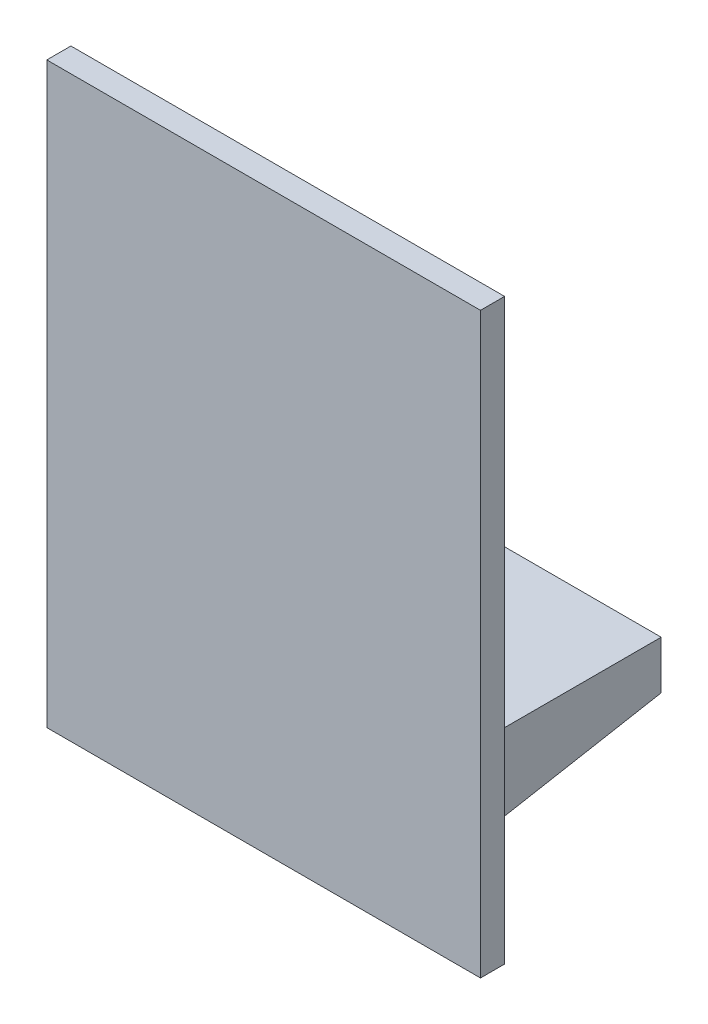
ISO-10303-21;
HEADER;
FILE_DESCRIPTION(('STEP AP214'),'2;1');
FILE_NAME('part.step','',(''),(''),'','','');
FILE_SCHEMA(('AUTOMOTIVE_DESIGN { 1 0 10303 214 1 1 1 1 }'));
ENDSEC;
DATA;
#1=APPLICATION_CONTEXT('core data for automotive mechanical design processes');
#2=APPLICATION_PROTOCOL_DEFINITION('international standard','automotive_design',2000,#1);
#3=PRODUCT_CONTEXT('',#1,'mechanical');
#4=PRODUCT('Part','Part','',(#3));
#5=PRODUCT_RELATED_PRODUCT_CATEGORY('part','',(#4));
#6=PRODUCT_DEFINITION_FORMATION('','',#4);
#7=PRODUCT_DEFINITION_CONTEXT('part definition',#1,'design');
#8=PRODUCT_DEFINITION('design','',#6,#7);
#9=PRODUCT_DEFINITION_SHAPE('','',#8);
#10=(LENGTH_UNIT() NAMED_UNIT(*) SI_UNIT(.MILLI.,.METRE.));
#11=(NAMED_UNIT(*) PLANE_ANGLE_UNIT() SI_UNIT($,.RADIAN.));
#12=(NAMED_UNIT(*) SI_UNIT($,.STERADIAN.) SOLID_ANGLE_UNIT());
#13=UNCERTAINTY_MEASURE_WITH_UNIT(LENGTH_MEASURE(1.E-05),#10,'distance_accuracy_value','');
#14=(GEOMETRIC_REPRESENTATION_CONTEXT(3) GLOBAL_UNCERTAINTY_ASSIGNED_CONTEXT((#13)) GLOBAL_UNIT_ASSIGNED_CONTEXT((#10,
#11,#12)) REPRESENTATION_CONTEXT('',''));
#15=CARTESIAN_POINT('',(0.,0.,0.));
#16=DIRECTION('',(0.,0.,1.));
#17=DIRECTION('',(1.,0.,0.));
#18=AXIS2_PLACEMENT_3D('',#15,#16,#17);
#19=CARTESIAN_POINT('',(45.,-15.,55.));
#20=DIRECTION('',(0.,0.,-1.));
#21=DIRECTION('',(-1.,0.,0.));
#22=AXIS2_PLACEMENT_3D('',#19,#20,#21);
#23=PLANE('',#22);
#24=DIRECTION('',(-1.,0.,0.));
#25=VECTOR('',#24,1.);
#26=CARTESIAN_POINT('',(45.,-15.,55.));
#27=LINE('',#26,#25);
#28=CARTESIAN_POINT('',(45.,-15.,55.));
#29=VERTEX_POINT('',#28);
#30=CARTESIAN_POINT('',(42.5,-15.,55.));
#31=VERTEX_POINT('',#30);
#32=EDGE_CURVE('E140',#29,#31,#27,.T.);
#33=ORIENTED_EDGE('',*,*,#32,.T.);
#34=DIRECTION('',(0.,1.,0.));
#35=VECTOR('',#34,1.);
#36=CARTESIAN_POINT('',(42.5,-15.,55.));
#37=LINE('',#36,#35);
#38=CARTESIAN_POINT('',(42.5,25.,55.));
#39=VERTEX_POINT('',#38);
#40=EDGE_CURVE('E252',#31,#39,#37,.T.);
#41=ORIENTED_EDGE('',*,*,#40,.T.);
#42=DIRECTION('',(-1.,0.,0.));
#43=VECTOR('',#42,1.);
#44=CARTESIAN_POINT('',(45.,25.,55.));
#45=LINE('',#44,#43);
#46=CARTESIAN_POINT('',(-42.5,25.,55.));
#47=VERTEX_POINT('',#46);
#48=EDGE_CURVE('E245',#39,#47,#45,.T.);
#49=ORIENTED_EDGE('',*,*,#48,.T.);
#50=DIRECTION('',(0.,-1.,0.));
#51=VECTOR('',#50,1.);
#52=CARTESIAN_POINT('',(-42.5,-15.,55.));
#53=LINE('',#52,#51);
#54=CARTESIAN_POINT('',(-42.5,-15.,55.));
#55=VERTEX_POINT('',#54);
#56=EDGE_CURVE('E248',#47,#55,#53,.T.);
#57=ORIENTED_EDGE('',*,*,#56,.T.);
#58=CARTESIAN_POINT('',(-45.,-15.,55.));
#59=VERTEX_POINT('',#58);
#60=EDGE_CURVE('E141',#55,#59,#27,.T.);
#61=ORIENTED_EDGE('',*,*,#60,.T.);
#62=DIRECTION('',(0.,1.,0.));
#63=VECTOR('',#62,1.);
#64=CARTESIAN_POINT('',(-45.,-15.,55.));
#65=LINE('',#64,#63);
#66=CARTESIAN_POINT('',(-45.,105.,55.));
#67=VERTEX_POINT('',#66);
#68=EDGE_CURVE('E209',#59,#67,#65,.T.);
#69=ORIENTED_EDGE('',*,*,#68,.T.);
#70=DIRECTION('',(-1.,0.,0.));
#71=VECTOR('',#70,1.);
#72=CARTESIAN_POINT('',(45.,105.,55.));
#73=LINE('',#72,#71);
#74=CARTESIAN_POINT('',(45.,105.,55.));
#75=VERTEX_POINT('',#74);
#76=EDGE_CURVE('E191',#75,#67,#73,.T.);
#77=ORIENTED_EDGE('',*,*,#76,.F.);
#78=DIRECTION('',(0.,1.,0.));
#79=VECTOR('',#78,1.);
#80=CARTESIAN_POINT('',(45.,-15.,55.));
#81=LINE('',#80,#79);
#82=EDGE_CURVE('E213',#29,#75,#81,.T.);
#83=ORIENTED_EDGE('',*,*,#82,.F.);
#84=EDGE_LOOP('',(#33,#41,#49,#57,#61,#69,#77,#83));
#85=FACE_BOUND('',#84,.T.);
#86=ADVANCED_FACE('F39',(#85),#23,.T.);
#87=CARTESIAN_POINT('',(22.5,-5.,55.));
#88=DIRECTION('',(-1.,0.,0.));
#89=DIRECTION('',(0.,0.,1.));
#90=AXIS2_PLACEMENT_3D('',#87,#88,#89);
#91=PLANE('',#90);
#92=DIRECTION('',(0.,0.,-1.));
#93=VECTOR('',#92,1.);
#94=CARTESIAN_POINT('',(22.5,5.,55.));
#95=LINE('',#94,#93);
#96=CARTESIAN_POINT('',(22.5,5.,35.));
#97=VERTEX_POINT('',#96);
#98=CARTESIAN_POINT('',(22.5,5.,0.));
#99=VERTEX_POINT('',#98);
#100=EDGE_CURVE('E242',#97,#99,#95,.T.);
#101=ORIENTED_EDGE('',*,*,#100,.F.);
#102=DIRECTION('',(0.,1.,0.));
#103=VECTOR('',#102,1.);
#104=CARTESIAN_POINT('',(22.5,-5.,35.));
#105=LINE('',#104,#103);
#106=CARTESIAN_POINT('',(22.5,-11.3636363636364,35.));
#107=VERTEX_POINT('',#106);
#108=EDGE_CURVE('E256',#97,#107,#105,.F.);
#109=ORIENTED_EDGE('',*,*,#108,.T.);
#110=DIRECTION('',(0.,0.178885438199983,-0.983869910099908));
#111=VECTOR('',#110,1.);
#112=CARTESIAN_POINT('',(22.5,-5.,0.));
#113=LINE('',#112,#111);
#114=CARTESIAN_POINT('',(22.5,-5.,0.));
#115=VERTEX_POINT('',#114);
#116=EDGE_CURVE('E154',#107,#115,#113,.T.);
#117=ORIENTED_EDGE('',*,*,#116,.T.);
#118=DIRECTION('',(0.,1.,0.));
#119=VECTOR('',#118,1.);
#120=CARTESIAN_POINT('',(22.5,-5.,0.));
#121=LINE('',#120,#119);
#122=EDGE_CURVE('E212',#115,#99,#121,.T.);
#123=ORIENTED_EDGE('',*,*,#122,.T.);
#124=EDGE_LOOP('',(#101,#109,#117,#123));
#125=FACE_BOUND('',#124,.T.);
#126=ADVANCED_FACE('F351',(#125),#91,.F.);
#127=CARTESIAN_POINT('',(-22.5,5.,55.));
#128=DIRECTION('',(0.,-1.,0.));
#129=DIRECTION('',(0.,0.,-1.));
#130=AXIS2_PLACEMENT_3D('',#127,#128,#129);
#131=PLANE('',#130);
#132=DIRECTION('',(0.,0.,-1.));
#133=VECTOR('',#132,1.);
#134=CARTESIAN_POINT('',(-22.5,5.,55.));
#135=LINE('',#134,#133);
#136=CARTESIAN_POINT('',(-22.5,5.,35.));
#137=VERTEX_POINT('',#136);
#138=CARTESIAN_POINT('',(-22.5,5.,0.));
#139=VERTEX_POINT('',#138);
#140=EDGE_CURVE('E223',#137,#139,#135,.T.);
#141=ORIENTED_EDGE('',*,*,#140,.F.);
#142=DIRECTION('',(-1.,0.,0.));
#143=VECTOR('',#142,1.);
#144=CARTESIAN_POINT('',(-22.5,5.,35.));
#145=LINE('',#144,#143);
#146=EDGE_CURVE('E262',#137,#97,#145,.F.);
#147=ORIENTED_EDGE('',*,*,#146,.T.);
#148=ORIENTED_EDGE('',*,*,#100,.T.);
#149=DIRECTION('',(-1.,0.,0.));
#150=VECTOR('',#149,1.);
#151=CARTESIAN_POINT('',(-22.5,5.,0.));
#152=LINE('',#151,#150);
#153=EDGE_CURVE('E228',#99,#139,#152,.T.);
#154=ORIENTED_EDGE('',*,*,#153,.T.);
#155=EDGE_LOOP('',(#141,#147,#148,#154));
#156=FACE_BOUND('',#155,.T.);
#157=ADVANCED_FACE('F325',(#156),#131,.F.);
#158=CARTESIAN_POINT('',(-22.5,-5.,55.));
#159=DIRECTION('',(1.,0.,0.));
#160=DIRECTION('',(0.,0.,-1.));
#161=AXIS2_PLACEMENT_3D('',#158,#159,#160);
#162=PLANE('',#161);
#163=DIRECTION('',(0.,0.178885438199983,-0.983869910099908));
#164=VECTOR('',#163,1.);
#165=CARTESIAN_POINT('',(-22.5,-5.,0.));
#166=LINE('',#165,#164);
#167=CARTESIAN_POINT('',(-22.5,-11.3636363636364,35.));
#168=VERTEX_POINT('',#167);
#169=CARTESIAN_POINT('',(-22.5,-5.,0.));
#170=VERTEX_POINT('',#169);
#171=EDGE_CURVE('E276',#168,#170,#166,.T.);
#172=ORIENTED_EDGE('',*,*,#171,.F.);
#173=DIRECTION('',(0.,-1.,0.));
#174=VECTOR('',#173,1.);
#175=CARTESIAN_POINT('',(-22.5,-5.,35.));
#176=LINE('',#175,#174);
#177=EDGE_CURVE('E259',#168,#137,#176,.F.);
#178=ORIENTED_EDGE('',*,*,#177,.T.);
#179=ORIENTED_EDGE('',*,*,#140,.T.);
#180=DIRECTION('',(0.,-1.,0.));
#181=VECTOR('',#180,1.);
#182=CARTESIAN_POINT('',(-22.5,-5.,0.));
#183=LINE('',#182,#181);
#184=EDGE_CURVE('E232',#139,#170,#183,.T.);
#185=ORIENTED_EDGE('',*,*,#184,.T.);
#186=EDGE_LOOP('',(#172,#178,#179,#185));
#187=FACE_BOUND('',#186,.T.);
#188=ADVANCED_FACE('F323',(#187),#162,.F.);
#189=CARTESIAN_POINT('',(-22.5,-5.,55.));
#190=DIRECTION('',(0.,1.,0.));
#191=DIRECTION('',(0.,0.,1.));
#192=AXIS2_PLACEMENT_3D('',#189,#190,#191);
#193=PLANE('',#192);
#194=DIRECTION('',(1.,0.,0.));
#195=VECTOR('',#194,1.);
#196=CARTESIAN_POINT('',(-22.5,-5.,55.));
#197=LINE('',#196,#195);
#198=CARTESIAN_POINT('',(-17.5,-5.,55.));
#199=VERTEX_POINT('',#198);
#200=CARTESIAN_POINT('',(17.5,-5.,55.));
#201=VERTEX_POINT('',#200);
#202=EDGE_CURVE('E147',#199,#201,#197,.T.);
#203=ORIENTED_EDGE('',*,*,#202,.F.);
#204=DIRECTION('',(0.,0.,1.));
#205=VECTOR('',#204,1.);
#206=CARTESIAN_POINT('',(-17.5,-5.,55.));
#207=LINE('',#206,#205);
#208=CARTESIAN_POINT('',(-17.5,-5.,0.));
#209=VERTEX_POINT('',#208);
#210=EDGE_CURVE('E298',#209,#199,#207,.T.);
#211=ORIENTED_EDGE('',*,*,#210,.F.);
#212=DIRECTION('',(1.,0.,0.));
#213=VECTOR('',#212,1.);
#214=CARTESIAN_POINT('',(-22.5,-5.,0.));
#215=LINE('',#214,#213);
#216=CARTESIAN_POINT('',(17.5,-5.,0.));
#217=VERTEX_POINT('',#216);
#218=EDGE_CURVE('E236',#209,#217,#215,.T.);
#219=ORIENTED_EDGE('',*,*,#218,.T.);
#220=DIRECTION('',(0.,0.,1.));
#221=VECTOR('',#220,1.);
#222=CARTESIAN_POINT('',(17.5,-5.,55.));
#223=LINE('',#222,#221);
#224=EDGE_CURVE('E166',#217,#201,#223,.T.);
#225=ORIENTED_EDGE('',*,*,#224,.T.);
#226=EDGE_LOOP('',(#203,#211,#219,#225));
#227=FACE_BOUND('',#226,.T.);
#228=ADVANCED_FACE('F339',(#227),#193,.F.);
#229=CARTESIAN_POINT('',(0.,0.,0.));
#230=DIRECTION('',(0.,0.,-1.));
#231=DIRECTION('',(-1.,0.,0.));
#232=AXIS2_PLACEMENT_3D('',#229,#230,#231);
#233=PLANE('',#232);
#234=CARTESIAN_POINT('',(17.6733308574626,0.,0.));
#235=DIRECTION('',(0.,0.,-1.));
#236=DIRECTION('',(-1.,0.,0.));
#237=AXIS2_PLACEMENT_3D('',#234,#235,#236);
#238=CIRCLE('',#237,1.5);
#239=CARTESIAN_POINT('',(16.1733308574626,0.,0.));
#240=VERTEX_POINT('',#239);
#241=EDGE_CURVE('E278',#240,#240,#238,.T.);
#242=ORIENTED_EDGE('',*,*,#241,.F.);
#243=EDGE_LOOP('',(#242));
#244=FACE_BOUND('',#243,.T.);
#245=CARTESIAN_POINT('',(-17.3266691425374,0.,0.));
#246=DIRECTION('',(0.,0.,-1.));
#247=DIRECTION('',(-1.,0.,0.));
#248=AXIS2_PLACEMENT_3D('',#245,#246,#247);
#249=CIRCLE('',#248,1.5);
#250=CARTESIAN_POINT('',(-18.8266691425374,0.,0.));
#251=VERTEX_POINT('',#250);
#252=EDGE_CURVE('E290',#251,#251,#249,.T.);
#253=ORIENTED_EDGE('',*,*,#252,.F.);
#254=EDGE_LOOP('',(#253));
#255=FACE_BOUND('',#254,.T.);
#256=ORIENTED_EDGE('',*,*,#122,.F.);
#257=DIRECTION('',(1.,0.,0.));
#258=VECTOR('',#257,1.);
#259=CARTESIAN_POINT('',(17.5,-5.,0.));
#260=LINE('',#259,#258);
#261=EDGE_CURVE('E165',#217,#115,#260,.T.);
#262=ORIENTED_EDGE('',*,*,#261,.F.);
#263=ORIENTED_EDGE('',*,*,#218,.F.);
#264=EDGE_CURVE('E224',#170,#209,#215,.T.);
#265=ORIENTED_EDGE('',*,*,#264,.F.);
#266=ORIENTED_EDGE('',*,*,#184,.F.);
#267=ORIENTED_EDGE('',*,*,#153,.F.);
#268=EDGE_LOOP('',(#256,#262,#263,#265,#266,#267));
#269=FACE_BOUND('',#268,.T.);
#270=ADVANCED_FACE('F332',(#244,#255,#269),#233,.T.);
#271=CARTESIAN_POINT('',(-45.,-15.,55.));
#272=DIRECTION('',(-1.,0.,0.));
#273=DIRECTION('',(0.,0.,1.));
#274=AXIS2_PLACEMENT_3D('',#271,#272,#273);
#275=PLANE('',#274);
#276=DIRECTION('',(0.,1.,0.));
#277=VECTOR('',#276,1.);
#278=CARTESIAN_POINT('',(-45.,-15.,60.));
#279=LINE('',#278,#277);
#280=CARTESIAN_POINT('',(-45.,-15.,60.));
#281=VERTEX_POINT('',#280);
#282=CARTESIAN_POINT('',(-45.,105.,60.));
#283=VERTEX_POINT('',#282);
#284=EDGE_CURVE('E208',#281,#283,#279,.T.);
#285=ORIENTED_EDGE('',*,*,#284,.T.);
#286=DIRECTION('',(0.,0.,1.));
#287=VECTOR('',#286,1.);
#288=CARTESIAN_POINT('',(-45.,105.,55.));
#289=LINE('',#288,#287);
#290=EDGE_CURVE('E178',#67,#283,#289,.T.);
#291=ORIENTED_EDGE('',*,*,#290,.F.);
#292=ORIENTED_EDGE('',*,*,#68,.F.);
#293=DIRECTION('',(0.,0.,1.));
#294=VECTOR('',#293,1.);
#295=CARTESIAN_POINT('',(-45.,-15.,55.));
#296=LINE('',#295,#294);
#297=EDGE_CURVE('E195',#59,#281,#296,.T.);
#298=ORIENTED_EDGE('',*,*,#297,.T.);
#299=EDGE_LOOP('',(#285,#291,#292,#298));
#300=FACE_BOUND('',#299,.T.);
#301=ADVANCED_FACE('F346',(#300),#275,.T.);
#302=DIRECTION('',(0.,-1.,0.));
#303=VECTOR('',#302,1.);
#304=CARTESIAN_POINT('',(-17.5,-15.,55.));
#305=LINE('',#304,#303);
#306=CARTESIAN_POINT('',(-17.5,-15.,55.));
#307=VERTEX_POINT('',#306);
#308=EDGE_CURVE('E294',#199,#307,#305,.T.);
#309=ORIENTED_EDGE('',*,*,#308,.F.);
#310=ORIENTED_EDGE('',*,*,#202,.T.);
#311=DIRECTION('',(0.,-1.,0.));
#312=VECTOR('',#311,1.);
#313=CARTESIAN_POINT('',(17.5,-15.,55.));
#314=LINE('',#313,#312);
#315=CARTESIAN_POINT('',(17.5,-15.,55.));
#316=VERTEX_POINT('',#315);
#317=EDGE_CURVE('E144',#201,#316,#314,.T.);
#318=ORIENTED_EDGE('',*,*,#317,.T.);
#319=EDGE_CURVE('E130',#316,#307,#27,.T.);
#320=ORIENTED_EDGE('',*,*,#319,.T.);
#321=EDGE_LOOP('',(#309,#310,#318,#320));
#322=FACE_BOUND('',#321,.T.);
#323=ADVANCED_FACE('F145',(#322),#23,.T.);
#324=CARTESIAN_POINT('',(45.,-15.,55.));
#325=DIRECTION('',(1.,0.,0.));
#326=DIRECTION('',(0.,0.,-1.));
#327=AXIS2_PLACEMENT_3D('',#324,#325,#326);
#328=PLANE('',#327);
#329=ORIENTED_EDGE('',*,*,#82,.T.);
#330=DIRECTION('',(0.,0.,-1.));
#331=VECTOR('',#330,1.);
#332=CARTESIAN_POINT('',(45.,105.,55.));
#333=LINE('',#332,#331);
#334=CARTESIAN_POINT('',(45.,105.,60.));
#335=VERTEX_POINT('',#334);
#336=EDGE_CURVE('E187',#335,#75,#333,.T.);
#337=ORIENTED_EDGE('',*,*,#336,.F.);
#338=DIRECTION('',(0.,1.,0.));
#339=VECTOR('',#338,1.);
#340=CARTESIAN_POINT('',(45.,-15.,60.));
#341=LINE('',#340,#339);
#342=CARTESIAN_POINT('',(45.,-15.,60.));
#343=VERTEX_POINT('',#342);
#344=EDGE_CURVE('E216',#343,#335,#341,.T.);
#345=ORIENTED_EDGE('',*,*,#344,.F.);
#346=DIRECTION('',(0.,0.,-1.));
#347=VECTOR('',#346,1.);
#348=CARTESIAN_POINT('',(45.,-15.,55.));
#349=LINE('',#348,#347);
#350=EDGE_CURVE('E203',#343,#29,#349,.T.);
#351=ORIENTED_EDGE('',*,*,#350,.T.);
#352=EDGE_LOOP('',(#329,#337,#345,#351));
#353=FACE_BOUND('',#352,.T.);
#354=ADVANCED_FACE('F361',(#353),#328,.T.);
#355=CARTESIAN_POINT('',(45.,-15.,60.));
#356=DIRECTION('',(0.,0.,1.));
#357=DIRECTION('',(1.,0.,0.));
#358=AXIS2_PLACEMENT_3D('',#355,#356,#357);
#359=PLANE('',#358);
#360=ORIENTED_EDGE('',*,*,#344,.T.);
#361=DIRECTION('',(1.,0.,0.));
#362=VECTOR('',#361,1.);
#363=CARTESIAN_POINT('',(45.,105.,60.));
#364=LINE('',#363,#362);
#365=EDGE_CURVE('E183',#283,#335,#364,.T.);
#366=ORIENTED_EDGE('',*,*,#365,.F.);
#367=ORIENTED_EDGE('',*,*,#284,.F.);
#368=DIRECTION('',(1.,0.,0.));
#369=VECTOR('',#368,1.);
#370=CARTESIAN_POINT('',(45.,-15.,60.));
#371=LINE('',#370,#369);
#372=EDGE_CURVE('E199',#281,#343,#371,.T.);
#373=ORIENTED_EDGE('',*,*,#372,.T.);
#374=EDGE_LOOP('',(#360,#366,#367,#373));
#375=FACE_BOUND('',#374,.T.);
#376=ADVANCED_FACE('F366',(#375),#359,.T.);
#377=CARTESIAN_POINT('',(0.,-15.,0.));
#378=DIRECTION('',(0.,-1.,0.));
#379=DIRECTION('',(0.,0.,-1.));
#380=AXIS2_PLACEMENT_3D('',#377,#378,#379);
#381=PLANE('',#380);
#382=ORIENTED_EDGE('',*,*,#297,.F.);
#383=ORIENTED_EDGE('',*,*,#60,.F.);
#384=DIRECTION('',(-1.,0.,0.));
#385=VECTOR('',#384,1.);
#386=CARTESIAN_POINT('',(-17.5,-15.,55.));
#387=LINE('',#386,#385);
#388=EDGE_CURVE('E136',#307,#55,#387,.T.);
#389=ORIENTED_EDGE('',*,*,#388,.F.);
#390=ORIENTED_EDGE('',*,*,#319,.F.);
#391=DIRECTION('',(1.,0.,0.));
#392=VECTOR('',#391,1.);
#393=CARTESIAN_POINT('',(17.5,-15.,55.));
#394=LINE('',#393,#392);
#395=EDGE_CURVE('E58',#316,#31,#394,.T.);
#396=ORIENTED_EDGE('',*,*,#395,.T.);
#397=ORIENTED_EDGE('',*,*,#32,.F.);
#398=ORIENTED_EDGE('',*,*,#350,.F.);
#399=ORIENTED_EDGE('',*,*,#372,.F.);
#400=EDGE_LOOP('',(#382,#383,#389,#390,#396,#397,#398,#399));
#401=FACE_BOUND('',#400,.T.);
#402=ADVANCED_FACE('F133',(#401),#381,.T.);
#403=CARTESIAN_POINT('',(0.,105.,0.));
#404=DIRECTION('',(0.,-1.,0.));
#405=DIRECTION('',(0.,0.,-1.));
#406=AXIS2_PLACEMENT_3D('',#403,#404,#405);
#407=PLANE('',#406);
#408=ORIENTED_EDGE('',*,*,#290,.T.);
#409=ORIENTED_EDGE('',*,*,#365,.T.);
#410=ORIENTED_EDGE('',*,*,#336,.T.);
#411=ORIENTED_EDGE('',*,*,#76,.T.);
#412=EDGE_LOOP('',(#408,#409,#410,#411));
#413=FACE_BOUND('',#412,.T.);
#414=ADVANCED_FACE('F378',(#413),#407,.F.);
#415=CARTESIAN_POINT('',(17.5,-5.,0.));
#416=DIRECTION('',(0.,-0.983869910099907,-0.178885438199983));
#417=DIRECTION('',(0.,0.178885438199983,-0.983869910099907));
#418=AXIS2_PLACEMENT_3D('',#415,#416,#417);
#419=PLANE('',#418);
#420=ORIENTED_EDGE('',*,*,#116,.F.);
#421=CARTESIAN_POINT('',(42.5,-11.3636363636364,35.));
#422=DIRECTION('',(0.,-0.983869910099907,-0.178885438199983));
#423=DIRECTION('',(0.,0.178885438199983,-0.983869910099907));
#424=AXIS2_PLACEMENT_3D('',#421,#422,#423);
#425=ELLIPSE('',#424,20.3278907045435,20.);
#426=EDGE_CURVE('E50',#107,#31,#425,.F.);
#427=ORIENTED_EDGE('',*,*,#426,.T.);
#428=ORIENTED_EDGE('',*,*,#395,.F.);
#429=DIRECTION('',(0.,0.178885438199983,-0.983869910099908));
#430=VECTOR('',#429,1.);
#431=CARTESIAN_POINT('',(17.5,-5.,0.));
#432=LINE('',#431,#430);
#433=EDGE_CURVE('E153',#316,#217,#432,.T.);
#434=ORIENTED_EDGE('',*,*,#433,.T.);
#435=ORIENTED_EDGE('',*,*,#261,.T.);
#436=EDGE_LOOP('',(#420,#427,#428,#434,#435));
#437=FACE_BOUND('',#436,.T.);
#438=ADVANCED_FACE('F160',(#437),#419,.T.);
#439=CARTESIAN_POINT('',(17.5,0.,0.));
#440=DIRECTION('',(-1.,0.,0.));
#441=DIRECTION('',(0.,0.,1.));
#442=AXIS2_PLACEMENT_3D('',#439,#440,#441);
#443=PLANE('',#442);
#444=ORIENTED_EDGE('',*,*,#317,.F.);
#445=ORIENTED_EDGE('',*,*,#224,.F.);
#446=ORIENTED_EDGE('',*,*,#433,.F.);
#447=EDGE_LOOP('',(#444,#445,#446));
#448=FACE_BOUND('',#447,.T.);
#449=ADVANCED_FACE('F168',(#448),#443,.T.);
#450=CARTESIAN_POINT('',(-17.5,-5.,0.));
#451=DIRECTION('',(0.,0.983869910099907,0.178885438199983));
#452=DIRECTION('',(0.,-0.178885438199983,0.983869910099907));
#453=AXIS2_PLACEMENT_3D('',#450,#451,#452);
#454=PLANE('',#453);
#455=ORIENTED_EDGE('',*,*,#388,.T.);
#456=CARTESIAN_POINT('',(-42.5,-11.3636363636364,35.));
#457=DIRECTION('',(0.,0.983869910099907,0.178885438199983));
#458=DIRECTION('',(0.,-0.178885438199983,0.983869910099907));
#459=AXIS2_PLACEMENT_3D('',#456,#457,#458);
#460=ELLIPSE('',#459,20.3278907045435,20.);
#461=EDGE_CURVE('E11',#55,#168,#460,.T.);
#462=ORIENTED_EDGE('',*,*,#461,.T.);
#463=ORIENTED_EDGE('',*,*,#171,.T.);
#464=ORIENTED_EDGE('',*,*,#264,.T.);
#465=DIRECTION('',(0.,0.178885438199983,-0.983869910099908));
#466=VECTOR('',#465,1.);
#467=CARTESIAN_POINT('',(-17.5,-5.,0.));
#468=LINE('',#467,#466);
#469=EDGE_CURVE('E302',#307,#209,#468,.T.);
#470=ORIENTED_EDGE('',*,*,#469,.F.);
#471=EDGE_LOOP('',(#455,#462,#463,#464,#470));
#472=FACE_BOUND('',#471,.T.);
#473=ADVANCED_FACE('F309',(#472),#454,.F.);
#474=CARTESIAN_POINT('',(-17.5,0.,0.));
#475=DIRECTION('',(1.,0.,0.));
#476=DIRECTION('',(0.,0.,1.));
#477=AXIS2_PLACEMENT_3D('',#474,#475,#476);
#478=PLANE('',#477);
#479=ORIENTED_EDGE('',*,*,#308,.T.);
#480=ORIENTED_EDGE('',*,*,#469,.T.);
#481=ORIENTED_EDGE('',*,*,#210,.T.);
#482=EDGE_LOOP('',(#479,#480,#481));
#483=FACE_BOUND('',#482,.T.);
#484=ADVANCED_FACE('F338',(#483),#478,.T.);
#485=CARTESIAN_POINT('',(-42.5,-15.,35.));
#486=DIRECTION('',(0.,-1.,0.));
#487=DIRECTION('',(0.,0.,-1.));
#488=AXIS2_PLACEMENT_3D('',#485,#486,#487);
#489=CYLINDRICAL_SURFACE('',#488,20.);
#490=ORIENTED_EDGE('',*,*,#461,.F.);
#491=ORIENTED_EDGE('',*,*,#56,.F.);
#492=CARTESIAN_POINT('',(-42.5,25.,35.));
#493=DIRECTION('',(-0.707106781186547,-0.707106781186547,0.));
#494=DIRECTION('',(-0.707106781186547,0.707106781186547,0.));
#495=AXIS2_PLACEMENT_3D('',#492,#493,#494);
#496=ELLIPSE('',#495,28.2842712474619,20.);
#497=EDGE_CURVE('E43',#137,#47,#496,.T.);
#498=ORIENTED_EDGE('',*,*,#497,.F.);
#499=ORIENTED_EDGE('',*,*,#177,.F.);
#500=EDGE_LOOP('',(#490,#491,#498,#499));
#501=FACE_BOUND('',#500,.T.);
#502=ADVANCED_FACE('F41',(#501),#489,.F.);
#503=CARTESIAN_POINT('',(45.,25.,35.));
#504=DIRECTION('',(-1.,0.,0.));
#505=DIRECTION('',(0.,0.,1.));
#506=AXIS2_PLACEMENT_3D('',#503,#504,#505);
#507=CYLINDRICAL_SURFACE('',#506,20.);
#508=ORIENTED_EDGE('',*,*,#497,.T.);
#509=ORIENTED_EDGE('',*,*,#48,.F.);
#510=CARTESIAN_POINT('',(42.5,25.,35.));
#511=DIRECTION('',(-0.707106781186547,0.707106781186547,0.));
#512=DIRECTION('',(-0.707106781186547,-0.707106781186547,0.));
#513=AXIS2_PLACEMENT_3D('',#510,#511,#512);
#514=ELLIPSE('',#513,28.2842712474619,20.);
#515=EDGE_CURVE('E266',#97,#39,#514,.T.);
#516=ORIENTED_EDGE('',*,*,#515,.F.);
#517=ORIENTED_EDGE('',*,*,#146,.F.);
#518=EDGE_LOOP('',(#508,#509,#516,#517));
#519=FACE_BOUND('',#518,.T.);
#520=ADVANCED_FACE('F387',(#519),#507,.F.);
#521=CARTESIAN_POINT('',(42.5,-15.,35.));
#522=DIRECTION('',(0.,1.,0.));
#523=DIRECTION('',(0.,0.,1.));
#524=AXIS2_PLACEMENT_3D('',#521,#522,#523);
#525=CYLINDRICAL_SURFACE('',#524,20.);
#526=ORIENTED_EDGE('',*,*,#426,.F.);
#527=ORIENTED_EDGE('',*,*,#108,.F.);
#528=ORIENTED_EDGE('',*,*,#515,.T.);
#529=ORIENTED_EDGE('',*,*,#40,.F.);
#530=EDGE_LOOP('',(#526,#527,#528,#529));
#531=FACE_BOUND('',#530,.T.);
#532=ADVANCED_FACE('F385',(#531),#525,.F.);
#533=CARTESIAN_POINT('',(-17.3266691425374,0.,10.));
#534=DIRECTION('',(0.,0.,-1.));
#535=DIRECTION('',(-1.,0.,0.));
#536=AXIS2_PLACEMENT_3D('',#533,#534,#535);
#537=CYLINDRICAL_SURFACE('',#536,1.5);
#538=CARTESIAN_POINT('',(-17.3266691425374,0.,10.));
#539=DIRECTION('',(0.,0.,-1.));
#540=DIRECTION('',(-1.,0.,0.));
#541=AXIS2_PLACEMENT_3D('',#538,#539,#540);
#542=CIRCLE('',#541,1.5);
#543=CARTESIAN_POINT('',(-18.8266691425374,0.,10.));
#544=VERTEX_POINT('',#543);
#545=EDGE_CURVE('E284',#544,#544,#542,.T.);
#546=ORIENTED_EDGE('',*,*,#545,.F.);
#547=EDGE_LOOP('',(#546));
#548=FACE_BOUND('',#547,.T.);
#549=ORIENTED_EDGE('',*,*,#252,.T.);
#550=EDGE_LOOP('',(#549));
#551=FACE_BOUND('',#550,.T.);
#552=ADVANCED_FACE('F393',(#548,#551),#537,.F.);
#553=CARTESIAN_POINT('',(-17.3266691425374,0.,10.));
#554=DIRECTION('',(0.,0.,-1.));
#555=DIRECTION('',(-1.,0.,0.));
#556=AXIS2_PLACEMENT_3D('',#553,#554,#555);
#557=PLANE('',#556);
#558=ORIENTED_EDGE('',*,*,#545,.T.);
#559=EDGE_LOOP('',(#558));
#560=FACE_BOUND('',#559,.T.);
#561=ADVANCED_FACE('F470',(#560),#557,.T.);
#562=CARTESIAN_POINT('',(17.6733308574626,0.,10.));
#563=DIRECTION('',(0.,0.,-1.));
#564=DIRECTION('',(-1.,0.,0.));
#565=AXIS2_PLACEMENT_3D('',#562,#563,#564);
#566=CYLINDRICAL_SURFACE('',#565,1.5);
#567=CARTESIAN_POINT('',(17.6733308574626,0.,10.));
#568=DIRECTION('',(0.,0.,-1.));
#569=DIRECTION('',(-1.,0.,0.));
#570=AXIS2_PLACEMENT_3D('',#567,#568,#569);
#571=CIRCLE('',#570,1.5);
#572=CARTESIAN_POINT('',(16.1733308574626,0.,10.));
#573=VERTEX_POINT('',#572);
#574=EDGE_CURVE('E268',#573,#573,#571,.T.);
#575=ORIENTED_EDGE('',*,*,#574,.F.);
#576=EDGE_LOOP('',(#575));
#577=FACE_BOUND('',#576,.T.);
#578=ORIENTED_EDGE('',*,*,#241,.T.);
#579=EDGE_LOOP('',(#578));
#580=FACE_BOUND('',#579,.T.);
#581=ADVANCED_FACE('F480',(#577,#580),#566,.F.);
#582=CARTESIAN_POINT('',(17.6733308574626,0.,10.));
#583=DIRECTION('',(0.,0.,-1.));
#584=DIRECTION('',(-1.,0.,0.));
#585=AXIS2_PLACEMENT_3D('',#582,#583,#584);
#586=PLANE('',#585);
#587=ORIENTED_EDGE('',*,*,#574,.T.);
#588=EDGE_LOOP('',(#587));
#589=FACE_BOUND('',#588,.T.);
#590=ADVANCED_FACE('F490',(#589),#586,.T.);
#591=CLOSED_SHELL('',(#86,#126,#157,#188,#228,#270,#301,#323,#354,#376,#402,#414,#438,#449,#473,
#484,#502,#520,#532,#552,#561,#581,#590));
#592=MANIFOLD_SOLID_BREP('B2',#591);
#593=ADVANCED_BREP_SHAPE_REPRESENTATION('',(#18,#592),#14);
#594=SHAPE_DEFINITION_REPRESENTATION(#9,#593);
ENDSEC;
END-ISO-10303-21;
